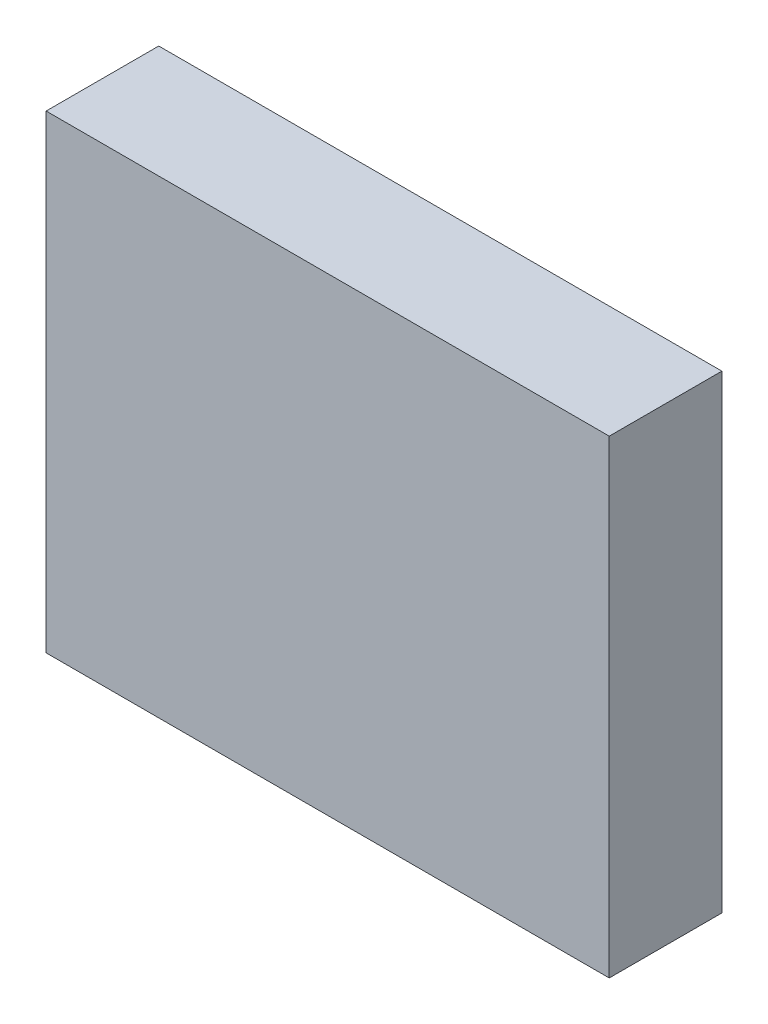
ISO-10303-21;
HEADER;
FILE_DESCRIPTION(('STEP AP214'),'2;1');
FILE_NAME('part.step','',(''),(''),'','','');
FILE_SCHEMA(('AUTOMOTIVE_DESIGN { 1 0 10303 214 1 1 1 1 }'));
ENDSEC;
DATA;
#1=APPLICATION_CONTEXT('core data for automotive mechanical design processes');
#2=APPLICATION_PROTOCOL_DEFINITION('international standard','automotive_design',2000,#1);
#3=PRODUCT_CONTEXT('',#1,'mechanical');
#4=PRODUCT('Part','Part','',(#3));
#5=PRODUCT_RELATED_PRODUCT_CATEGORY('part','',(#4));
#6=PRODUCT_DEFINITION_FORMATION('','',#4);
#7=PRODUCT_DEFINITION_CONTEXT('part definition',#1,'design');
#8=PRODUCT_DEFINITION('design','',#6,#7);
#9=PRODUCT_DEFINITION_SHAPE('','',#8);
#10=(LENGTH_UNIT() NAMED_UNIT(*) SI_UNIT(.MILLI.,.METRE.));
#11=(NAMED_UNIT(*) PLANE_ANGLE_UNIT() SI_UNIT($,.RADIAN.));
#12=(NAMED_UNIT(*) SI_UNIT($,.STERADIAN.) SOLID_ANGLE_UNIT());
#13=UNCERTAINTY_MEASURE_WITH_UNIT(LENGTH_MEASURE(1.E-05),#10,'distance_accuracy_value','');
#14=(GEOMETRIC_REPRESENTATION_CONTEXT(3) GLOBAL_UNCERTAINTY_ASSIGNED_CONTEXT((#13)) GLOBAL_UNIT_ASSIGNED_CONTEXT((#10,
#11,#12)) REPRESENTATION_CONTEXT('',''));
#15=CARTESIAN_POINT('',(0.,0.,0.));
#16=DIRECTION('',(0.,0.,1.));
#17=DIRECTION('',(1.,0.,0.));
#18=AXIS2_PLACEMENT_3D('',#15,#16,#17);
#19=CARTESIAN_POINT('',(940.,1680.,-300.));
#20=DIRECTION('',(-1.,0.,0.));
#21=DIRECTION('',(0.,0.,1.));
#22=AXIS2_PLACEMENT_3D('',#19,#20,#21);
#23=PLANE('',#22);
#24=DIRECTION('',(0.,-1.,0.));
#25=VECTOR('',#24,1.);
#26=CARTESIAN_POINT('',(940.,1680.,-240.));
#27=LINE('',#26,#25);
#28=CARTESIAN_POINT('',(940.,1930.,-240.));
#29=VERTEX_POINT('',#28);
#30=CARTESIAN_POINT('',(940.,1680.,-240.));
#31=VERTEX_POINT('',#30);
#32=EDGE_CURVE('E103',#29,#31,#27,.T.);
#33=ORIENTED_EDGE('',*,*,#32,.F.);
#34=DIRECTION('',(0.,0.,1.));
#35=VECTOR('',#34,1.);
#36=CARTESIAN_POINT('',(940.,1930.,-300.));
#37=LINE('',#36,#35);
#38=CARTESIAN_POINT('',(940.,1930.,-300.));
#39=VERTEX_POINT('',#38);
#40=EDGE_CURVE('E11',#39,#29,#37,.T.);
#41=ORIENTED_EDGE('',*,*,#40,.F.);
#42=DIRECTION('',(0.,-1.,0.));
#43=VECTOR('',#42,1.);
#44=CARTESIAN_POINT('',(940.,1680.,-300.));
#45=LINE('',#44,#43);
#46=CARTESIAN_POINT('',(940.,1680.,-300.));
#47=VERTEX_POINT('',#46);
#48=EDGE_CURVE('E97',#39,#47,#45,.T.);
#49=ORIENTED_EDGE('',*,*,#48,.T.);
#50=DIRECTION('',(0.,0.,1.));
#51=VECTOR('',#50,1.);
#52=CARTESIAN_POINT('',(940.,1680.,-300.));
#53=LINE('',#52,#51);
#54=EDGE_CURVE('E42',#47,#31,#53,.T.);
#55=ORIENTED_EDGE('',*,*,#54,.T.);
#56=EDGE_LOOP('',(#33,#41,#49,#55));
#57=FACE_BOUND('',#56,.T.);
#58=ADVANCED_FACE('F39',(#57),#23,.T.);
#59=CARTESIAN_POINT('',(940.,1930.,-300.));
#60=DIRECTION('',(0.,1.,0.));
#61=DIRECTION('',(0.,0.,1.));
#62=AXIS2_PLACEMENT_3D('',#59,#60,#61);
#63=PLANE('',#62);
#64=DIRECTION('',(-1.,0.,0.));
#65=VECTOR('',#64,1.);
#66=CARTESIAN_POINT('',(940.,1930.,-240.));
#67=LINE('',#66,#65);
#68=CARTESIAN_POINT('',(1240.,1930.,-240.));
#69=VERTEX_POINT('',#68);
#70=EDGE_CURVE('E99',#69,#29,#67,.T.);
#71=ORIENTED_EDGE('',*,*,#70,.F.);
#72=DIRECTION('',(0.,0.,1.));
#73=VECTOR('',#72,1.);
#74=CARTESIAN_POINT('',(1240.,1930.,-300.));
#75=LINE('',#74,#73);
#76=CARTESIAN_POINT('',(1240.,1930.,-300.));
#77=VERTEX_POINT('',#76);
#78=EDGE_CURVE('E48',#77,#69,#75,.T.);
#79=ORIENTED_EDGE('',*,*,#78,.F.);
#80=DIRECTION('',(-1.,0.,0.));
#81=VECTOR('',#80,1.);
#82=CARTESIAN_POINT('',(940.,1930.,-300.));
#83=LINE('',#82,#81);
#84=EDGE_CURVE('E94',#77,#39,#83,.T.);
#85=ORIENTED_EDGE('',*,*,#84,.T.);
#86=ORIENTED_EDGE('',*,*,#40,.T.);
#87=EDGE_LOOP('',(#71,#79,#85,#86));
#88=FACE_BOUND('',#87,.T.);
#89=ADVANCED_FACE('F113',(#88),#63,.T.);
#90=CARTESIAN_POINT('',(1240.,1680.,-300.));
#91=DIRECTION('',(1.,0.,0.));
#92=DIRECTION('',(0.,0.,-1.));
#93=AXIS2_PLACEMENT_3D('',#90,#91,#92);
#94=PLANE('',#93);
#95=DIRECTION('',(0.,1.,0.));
#96=VECTOR('',#95,1.);
#97=CARTESIAN_POINT('',(1240.,1680.,-240.));
#98=LINE('',#97,#96);
#99=CARTESIAN_POINT('',(1240.,1680.,-240.));
#100=VERTEX_POINT('',#99);
#101=EDGE_CURVE('E89',#100,#69,#98,.T.);
#102=ORIENTED_EDGE('',*,*,#101,.F.);
#103=DIRECTION('',(0.,0.,1.));
#104=VECTOR('',#103,1.);
#105=CARTESIAN_POINT('',(1240.,1680.,-300.));
#106=LINE('',#105,#104);
#107=CARTESIAN_POINT('',(1240.,1680.,-300.));
#108=VERTEX_POINT('',#107);
#109=EDGE_CURVE('E84',#108,#100,#106,.T.);
#110=ORIENTED_EDGE('',*,*,#109,.F.);
#111=DIRECTION('',(0.,1.,0.));
#112=VECTOR('',#111,1.);
#113=CARTESIAN_POINT('',(1240.,1680.,-300.));
#114=LINE('',#113,#112);
#115=EDGE_CURVE('E87',#108,#77,#114,.T.);
#116=ORIENTED_EDGE('',*,*,#115,.T.);
#117=ORIENTED_EDGE('',*,*,#78,.T.);
#118=EDGE_LOOP('',(#102,#110,#116,#117));
#119=FACE_BOUND('',#118,.T.);
#120=ADVANCED_FACE('F86',(#119),#94,.T.);
#121=CARTESIAN_POINT('',(940.,1680.,-300.));
#122=DIRECTION('',(0.,-1.,0.));
#123=DIRECTION('',(0.,0.,-1.));
#124=AXIS2_PLACEMENT_3D('',#121,#122,#123);
#125=PLANE('',#124);
#126=DIRECTION('',(1.,0.,0.));
#127=VECTOR('',#126,1.);
#128=CARTESIAN_POINT('',(940.,1680.,-240.));
#129=LINE('',#128,#127);
#130=EDGE_CURVE('E106',#31,#100,#129,.T.);
#131=ORIENTED_EDGE('',*,*,#130,.F.);
#132=ORIENTED_EDGE('',*,*,#54,.F.);
#133=DIRECTION('',(1.,0.,0.));
#134=VECTOR('',#133,1.);
#135=CARTESIAN_POINT('',(940.,1680.,-300.));
#136=LINE('',#135,#134);
#137=EDGE_CURVE('E93',#47,#108,#136,.T.);
#138=ORIENTED_EDGE('',*,*,#137,.T.);
#139=ORIENTED_EDGE('',*,*,#109,.T.);
#140=EDGE_LOOP('',(#131,#132,#138,#139));
#141=FACE_BOUND('',#140,.T.);
#142=ADVANCED_FACE('F96',(#141),#125,.T.);
#143=CARTESIAN_POINT('',(0.,0.,-300.));
#144=DIRECTION('',(0.,0.,-1.));
#145=DIRECTION('',(-1.,0.,0.));
#146=AXIS2_PLACEMENT_3D('',#143,#144,#145);
#147=PLANE('',#146);
#148=ORIENTED_EDGE('',*,*,#48,.F.);
#149=ORIENTED_EDGE('',*,*,#84,.F.);
#150=ORIENTED_EDGE('',*,*,#115,.F.);
#151=ORIENTED_EDGE('',*,*,#137,.F.);
#152=EDGE_LOOP('',(#148,#149,#150,#151));
#153=FACE_BOUND('',#152,.T.);
#154=ADVANCED_FACE('F92',(#153),#147,.T.);
#155=CARTESIAN_POINT('',(0.,0.,-240.));
#156=DIRECTION('',(0.,0.,-1.));
#157=DIRECTION('',(-1.,0.,0.));
#158=AXIS2_PLACEMENT_3D('',#155,#156,#157);
#159=PLANE('',#158);
#160=ORIENTED_EDGE('',*,*,#32,.T.);
#161=ORIENTED_EDGE('',*,*,#130,.T.);
#162=ORIENTED_EDGE('',*,*,#101,.T.);
#163=ORIENTED_EDGE('',*,*,#70,.T.);
#164=EDGE_LOOP('',(#160,#161,#162,#163));
#165=FACE_BOUND('',#164,.T.);
#166=ADVANCED_FACE('F112',(#165),#159,.F.);
#167=CLOSED_SHELL('',(#58,#89,#120,#142,#154,#166));
#168=MANIFOLD_SOLID_BREP('B2',#167);
#169=ADVANCED_BREP_SHAPE_REPRESENTATION('',(#18,#168),#14);
#170=SHAPE_DEFINITION_REPRESENTATION(#9,#169);
ENDSEC;
END-ISO-10303-21;
